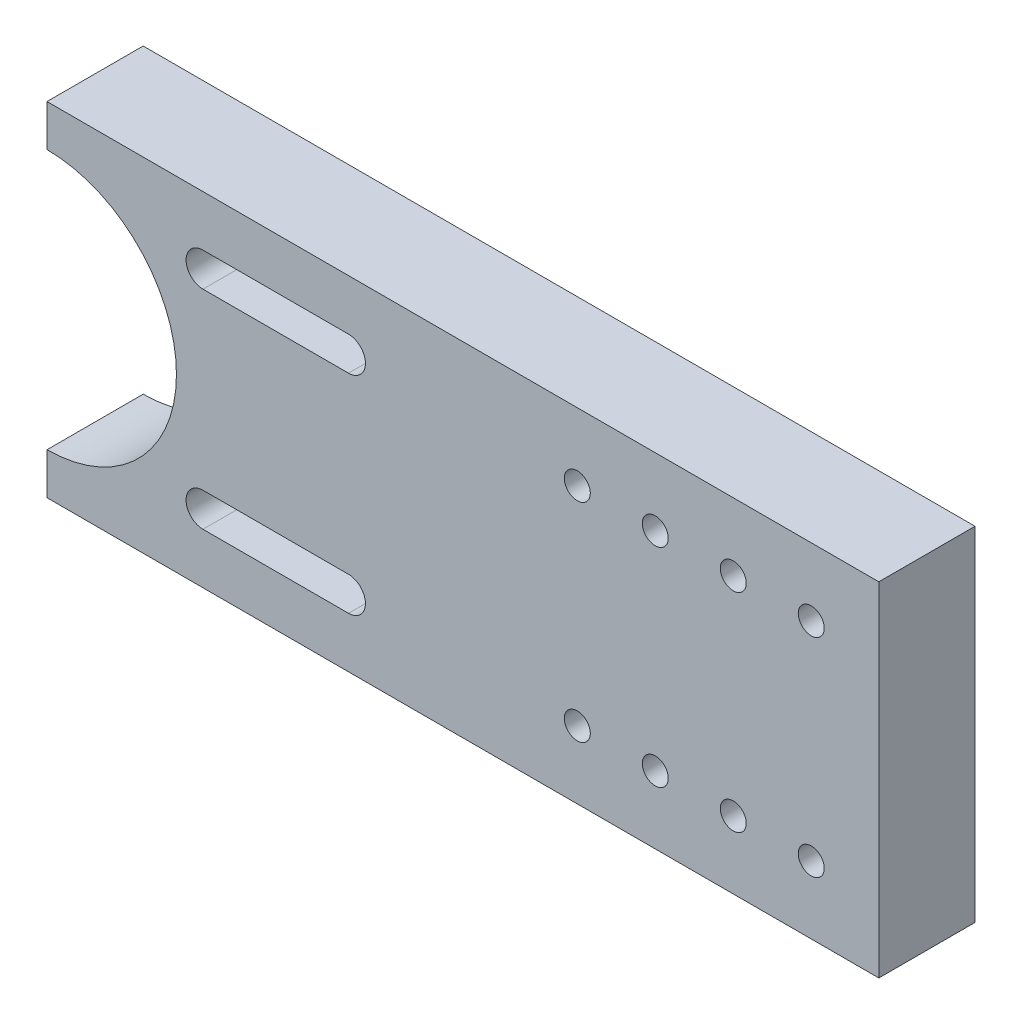
ISO-10303-21;
HEADER;
FILE_DESCRIPTION(('STEP AP214'),'2;1');
FILE_NAME('part.step','',(''),(''),'','','');
FILE_SCHEMA(('AUTOMOTIVE_DESIGN { 1 0 10303 214 1 1 1 1 }'));
ENDSEC;
DATA;
#1=APPLICATION_CONTEXT('core data for automotive mechanical design processes');
#2=APPLICATION_PROTOCOL_DEFINITION('international standard','automotive_design',2000,#1);
#3=PRODUCT_CONTEXT('',#1,'mechanical');
#4=PRODUCT('Part','Part','',(#3));
#5=PRODUCT_RELATED_PRODUCT_CATEGORY('part','',(#4));
#6=PRODUCT_DEFINITION_FORMATION('','',#4);
#7=PRODUCT_DEFINITION_CONTEXT('part definition',#1,'design');
#8=PRODUCT_DEFINITION('design','',#6,#7);
#9=PRODUCT_DEFINITION_SHAPE('','',#8);
#10=(LENGTH_UNIT() NAMED_UNIT(*) SI_UNIT(.MILLI.,.METRE.));
#11=(NAMED_UNIT(*) PLANE_ANGLE_UNIT() SI_UNIT($,.RADIAN.));
#12=(NAMED_UNIT(*) SI_UNIT($,.STERADIAN.) SOLID_ANGLE_UNIT());
#13=UNCERTAINTY_MEASURE_WITH_UNIT(LENGTH_MEASURE(1.E-05),#10,'distance_accuracy_value','');
#14=(GEOMETRIC_REPRESENTATION_CONTEXT(3) GLOBAL_UNCERTAINTY_ASSIGNED_CONTEXT((#13)) GLOBAL_UNIT_ASSIGNED_CONTEXT((#10,
#11,#12)) REPRESENTATION_CONTEXT('',''));
#15=CARTESIAN_POINT('',(0.,0.,0.));
#16=DIRECTION('',(0.,0.,1.));
#17=DIRECTION('',(1.,0.,0.));
#18=AXIS2_PLACEMENT_3D('',#15,#16,#17);
#19=CARTESIAN_POINT('',(0.,0.,18.5));
#20=DIRECTION('',(1.,0.,0.));
#21=DIRECTION('',(0.,0.,-1.));
#22=AXIS2_PLACEMENT_3D('',#19,#20,#21);
#23=PLANE('',#22);
#24=CARTESIAN_POINT('',(0.,61.,4.75000000000006));
#25=DIRECTION('',(-1.,0.,0.));
#26=DIRECTION('',(0.,0.,1.));
#27=AXIS2_PLACEMENT_3D('',#24,#25,#26);
#28=CIRCLE('',#27,1.65);
#29=CARTESIAN_POINT('',(0.,61.,6.40000000000005));
#30=VERTEX_POINT('',#29);
#31=EDGE_CURVE('E170',#30,#30,#28,.T.);
#32=ORIENTED_EDGE('',*,*,#31,.F.);
#33=EDGE_LOOP('',(#32));
#34=FACE_BOUND('',#33,.T.);
#35=CARTESIAN_POINT('',(0.,61.,13.75));
#36=DIRECTION('',(-1.,0.,0.));
#37=DIRECTION('',(0.,0.,1.));
#38=AXIS2_PLACEMENT_3D('',#35,#36,#37);
#39=CIRCLE('',#38,1.65);
#40=CARTESIAN_POINT('',(0.,61.,15.4));
#41=VERTEX_POINT('',#40);
#42=EDGE_CURVE('E176',#41,#41,#39,.T.);
#43=ORIENTED_EDGE('',*,*,#42,.F.);
#44=EDGE_LOOP('',(#43));
#45=FACE_BOUND('',#44,.T.);
#46=DIRECTION('',(0.,-1.,0.));
#47=VECTOR('',#46,1.);
#48=CARTESIAN_POINT('',(0.,0.,0.));
#49=LINE('',#48,#47);
#50=CARTESIAN_POINT('',(0.,66.,0.));
#51=VERTEX_POINT('',#50);
#52=CARTESIAN_POINT('',(0.,57.9997999992,0.));
#53=VERTEX_POINT('',#52);
#54=EDGE_CURVE('E286',#51,#53,#49,.T.);
#55=ORIENTED_EDGE('',*,*,#54,.T.);
#56=DIRECTION('',(0.,0.,1.));
#57=VECTOR('',#56,1.);
#58=CARTESIAN_POINT('',(0.,57.9997999992,-1.5));
#59=LINE('',#58,#57);
#60=CARTESIAN_POINT('',(0.,57.9997999992,18.5));
#61=VERTEX_POINT('',#60);
#62=EDGE_CURVE('E271',#53,#61,#59,.T.);
#63=ORIENTED_EDGE('',*,*,#62,.T.);
#64=DIRECTION('',(0.,-1.,0.));
#65=VECTOR('',#64,1.);
#66=CARTESIAN_POINT('',(0.,0.,18.5));
#67=LINE('',#66,#65);
#68=CARTESIAN_POINT('',(0.,66.,18.5));
#69=VERTEX_POINT('',#68);
#70=EDGE_CURVE('E275',#69,#61,#67,.T.);
#71=ORIENTED_EDGE('',*,*,#70,.F.);
#72=DIRECTION('',(0.,0.,-1.));
#73=VECTOR('',#72,1.);
#74=CARTESIAN_POINT('',(0.,66.,18.5));
#75=LINE('',#74,#73);
#76=EDGE_CURVE('E285',#69,#51,#75,.T.);
#77=ORIENTED_EDGE('',*,*,#76,.T.);
#78=EDGE_LOOP('',(#55,#63,#71,#77));
#79=FACE_BOUND('',#78,.T.);
#80=ADVANCED_FACE('F37',(#34,#45,#79),#23,.F.);
#81=CARTESIAN_POINT('',(0.,4.99999999999999,4.75000000000006));
#82=DIRECTION('',(-1.,0.,0.));
#83=DIRECTION('',(0.,0.,1.));
#84=AXIS2_PLACEMENT_3D('',#81,#82,#83);
#85=CIRCLE('',#84,1.65);
#86=CARTESIAN_POINT('',(0.,4.99999999999999,6.40000000000006));
#87=VERTEX_POINT('',#86);
#88=EDGE_CURVE('E160',#87,#87,#85,.T.);
#89=ORIENTED_EDGE('',*,*,#88,.F.);
#90=EDGE_LOOP('',(#89));
#91=FACE_BOUND('',#90,.T.);
#92=CARTESIAN_POINT('',(0.,5.,13.7500000000001));
#93=DIRECTION('',(-1.,0.,0.));
#94=DIRECTION('',(0.,0.,1.));
#95=AXIS2_PLACEMENT_3D('',#92,#93,#94);
#96=CIRCLE('',#95,1.65);
#97=CARTESIAN_POINT('',(0.,5.,15.4000000000001));
#98=VERTEX_POINT('',#97);
#99=EDGE_CURVE('E159',#98,#98,#96,.T.);
#100=ORIENTED_EDGE('',*,*,#99,.F.);
#101=EDGE_LOOP('',(#100));
#102=FACE_BOUND('',#101,.T.);
#103=CARTESIAN_POINT('',(0.,8.00020000080001,18.5));
#104=VERTEX_POINT('',#103);
#105=CARTESIAN_POINT('',(0.,0.,18.5));
#106=VERTEX_POINT('',#105);
#107=EDGE_CURVE('E279',#104,#106,#67,.T.);
#108=ORIENTED_EDGE('',*,*,#107,.F.);
#109=DIRECTION('',(0.,0.,1.));
#110=VECTOR('',#109,1.);
#111=CARTESIAN_POINT('',(0.,8.0002000008,-1.5));
#112=LINE('',#111,#110);
#113=CARTESIAN_POINT('',(0.,8.0002000008,0.));
#114=VERTEX_POINT('',#113);
#115=EDGE_CURVE('E268',#104,#114,#112,.F.);
#116=ORIENTED_EDGE('',*,*,#115,.T.);
#117=CARTESIAN_POINT('',(0.,0.,0.));
#118=VERTEX_POINT('',#117);
#119=EDGE_CURVE('E274',#114,#118,#49,.T.);
#120=ORIENTED_EDGE('',*,*,#119,.T.);
#121=DIRECTION('',(0.,0.,-1.));
#122=VECTOR('',#121,1.);
#123=CARTESIAN_POINT('',(0.,0.,18.5));
#124=LINE('',#123,#122);
#125=EDGE_CURVE('E303',#106,#118,#124,.T.);
#126=ORIENTED_EDGE('',*,*,#125,.F.);
#127=EDGE_LOOP('',(#108,#116,#120,#126));
#128=FACE_BOUND('',#127,.T.);
#129=ADVANCED_FACE('F354',(#91,#102,#128),#23,.F.);
#130=CARTESIAN_POINT('',(0.,0.,18.5));
#131=DIRECTION('',(0.,1.,0.));
#132=DIRECTION('',(0.,0.,1.));
#133=AXIS2_PLACEMENT_3D('',#130,#131,#132);
#134=PLANE('',#133);
#135=DIRECTION('',(1.,0.,0.));
#136=VECTOR('',#135,1.);
#137=CARTESIAN_POINT('',(0.,0.,0.));
#138=LINE('',#137,#136);
#139=CARTESIAN_POINT('',(160.,0.,0.));
#140=VERTEX_POINT('',#139);
#141=EDGE_CURVE('E289',#118,#140,#138,.T.);
#142=ORIENTED_EDGE('',*,*,#141,.T.);
#143=DIRECTION('',(0.,0.,-1.));
#144=VECTOR('',#143,1.);
#145=CARTESIAN_POINT('',(160.,0.,18.5));
#146=LINE('',#145,#144);
#147=CARTESIAN_POINT('',(160.,0.,18.5));
#148=VERTEX_POINT('',#147);
#149=EDGE_CURVE('E300',#148,#140,#146,.T.);
#150=ORIENTED_EDGE('',*,*,#149,.F.);
#151=DIRECTION('',(1.,0.,0.));
#152=VECTOR('',#151,1.);
#153=CARTESIAN_POINT('',(0.,0.,18.5));
#154=LINE('',#153,#152);
#155=EDGE_CURVE('E278',#106,#148,#154,.T.);
#156=ORIENTED_EDGE('',*,*,#155,.F.);
#157=ORIENTED_EDGE('',*,*,#125,.T.);
#158=EDGE_LOOP('',(#142,#150,#156,#157));
#159=FACE_BOUND('',#158,.T.);
#160=ADVANCED_FACE('F361',(#159),#134,.F.);
#161=CARTESIAN_POINT('',(160.,0.,18.5));
#162=DIRECTION('',(-1.,0.,0.));
#163=DIRECTION('',(0.,0.,1.));
#164=AXIS2_PLACEMENT_3D('',#161,#162,#163);
#165=PLANE('',#164);
#166=DIRECTION('',(0.,1.,0.));
#167=VECTOR('',#166,1.);
#168=CARTESIAN_POINT('',(160.,0.,0.));
#169=LINE('',#168,#167);
#170=CARTESIAN_POINT('',(160.,66.,0.));
#171=VERTEX_POINT('',#170);
#172=EDGE_CURVE('E291',#140,#171,#169,.T.);
#173=ORIENTED_EDGE('',*,*,#172,.T.);
#174=DIRECTION('',(0.,0.,-1.));
#175=VECTOR('',#174,1.);
#176=CARTESIAN_POINT('',(160.,66.,18.5));
#177=LINE('',#176,#175);
#178=CARTESIAN_POINT('',(160.,66.,18.5));
#179=VERTEX_POINT('',#178);
#180=EDGE_CURVE('E297',#179,#171,#177,.T.);
#181=ORIENTED_EDGE('',*,*,#180,.F.);
#182=DIRECTION('',(0.,1.,0.));
#183=VECTOR('',#182,1.);
#184=CARTESIAN_POINT('',(160.,0.,18.5));
#185=LINE('',#184,#183);
#186=EDGE_CURVE('E281',#148,#179,#185,.T.);
#187=ORIENTED_EDGE('',*,*,#186,.F.);
#188=ORIENTED_EDGE('',*,*,#149,.T.);
#189=EDGE_LOOP('',(#173,#181,#187,#188));
#190=FACE_BOUND('',#189,.T.);
#191=ADVANCED_FACE('F431',(#190),#165,.F.);
#192=CARTESIAN_POINT('',(0.,66.,18.5));
#193=DIRECTION('',(0.,-1.,0.));
#194=DIRECTION('',(0.,0.,-1.));
#195=AXIS2_PLACEMENT_3D('',#192,#193,#194);
#196=PLANE('',#195);
#197=DIRECTION('',(-1.,0.,0.));
#198=VECTOR('',#197,1.);
#199=CARTESIAN_POINT('',(0.,66.,0.));
#200=LINE('',#199,#198);
#201=EDGE_CURVE('E293',#171,#51,#200,.T.);
#202=ORIENTED_EDGE('',*,*,#201,.T.);
#203=ORIENTED_EDGE('',*,*,#76,.F.);
#204=DIRECTION('',(-1.,0.,0.));
#205=VECTOR('',#204,1.);
#206=CARTESIAN_POINT('',(0.,66.,18.5));
#207=LINE('',#206,#205);
#208=EDGE_CURVE('E283',#179,#69,#207,.T.);
#209=ORIENTED_EDGE('',*,*,#208,.F.);
#210=ORIENTED_EDGE('',*,*,#180,.T.);
#211=EDGE_LOOP('',(#202,#203,#209,#210));
#212=FACE_BOUND('',#211,.T.);
#213=ADVANCED_FACE('F348',(#212),#196,.F.);
#214=CARTESIAN_POINT('',(0.,66.,18.5));
#215=DIRECTION('',(0.,0.,-1.));
#216=DIRECTION('',(-1.,0.,0.));
#217=AXIS2_PLACEMENT_3D('',#214,#215,#216);
#218=PLANE('',#217);
#219=DIRECTION('',(-1.,0.,0.));
#220=VECTOR('',#219,1.);
#221=CARTESIAN_POINT('',(0.,9.74999999999999,18.5));
#222=LINE('',#221,#220);
#223=CARTESIAN_POINT('',(58.,9.74999999999998,18.5));
#224=VERTEX_POINT('',#223);
#225=CARTESIAN_POINT('',(30.,9.74999999999999,18.5));
#226=VERTEX_POINT('',#225);
#227=EDGE_CURVE('E204',#224,#226,#222,.T.);
#228=ORIENTED_EDGE('',*,*,#227,.T.);
#229=CARTESIAN_POINT('',(30.,13.,18.5));
#230=DIRECTION('',(0.,0.,-1.));
#231=DIRECTION('',(-1.,0.,0.));
#232=AXIS2_PLACEMENT_3D('',#229,#230,#231);
#233=CIRCLE('',#232,3.25000000000001);
#234=CARTESIAN_POINT('',(30.,16.25,18.5));
#235=VERTEX_POINT('',#234);
#236=EDGE_CURVE('E207',#226,#235,#233,.T.);
#237=ORIENTED_EDGE('',*,*,#236,.T.);
#238=DIRECTION('',(1.,0.,0.));
#239=VECTOR('',#238,1.);
#240=CARTESIAN_POINT('',(0.,16.25,18.5));
#241=LINE('',#240,#239);
#242=CARTESIAN_POINT('',(58.,16.25,18.5));
#243=VERTEX_POINT('',#242);
#244=EDGE_CURVE('E194',#235,#243,#241,.T.);
#245=ORIENTED_EDGE('',*,*,#244,.T.);
#246=CARTESIAN_POINT('',(58.,13.,18.5));
#247=DIRECTION('',(0.,0.,-1.));
#248=DIRECTION('',(-1.,0.,0.));
#249=AXIS2_PLACEMENT_3D('',#246,#247,#248);
#250=CIRCLE('',#249,3.25000000000001);
#251=EDGE_CURVE('E201',#243,#224,#250,.T.);
#252=ORIENTED_EDGE('',*,*,#251,.T.);
#253=EDGE_LOOP('',(#228,#237,#245,#252));
#254=FACE_BOUND('',#253,.T.);
#255=DIRECTION('',(-1.,0.,0.));
#256=VECTOR('',#255,1.);
#257=CARTESIAN_POINT('',(0.,49.75,18.5));
#258=LINE('',#257,#256);
#259=CARTESIAN_POINT('',(58.,49.75,18.5));
#260=VERTEX_POINT('',#259);
#261=CARTESIAN_POINT('',(30.,49.75,18.5));
#262=VERTEX_POINT('',#261);
#263=EDGE_CURVE('E236',#260,#262,#258,.T.);
#264=ORIENTED_EDGE('',*,*,#263,.T.);
#265=CARTESIAN_POINT('',(30.,53.,18.5));
#266=DIRECTION('',(0.,0.,-1.));
#267=DIRECTION('',(-1.,0.,0.));
#268=AXIS2_PLACEMENT_3D('',#265,#266,#267);
#269=CIRCLE('',#268,3.25000000000001);
#270=CARTESIAN_POINT('',(30.,56.25,18.5));
#271=VERTEX_POINT('',#270);
#272=EDGE_CURVE('E239',#262,#271,#269,.T.);
#273=ORIENTED_EDGE('',*,*,#272,.T.);
#274=DIRECTION('',(1.,0.,0.));
#275=VECTOR('',#274,1.);
#276=CARTESIAN_POINT('',(0.,56.25,18.5));
#277=LINE('',#276,#275);
#278=CARTESIAN_POINT('',(58.,56.25,18.5));
#279=VERTEX_POINT('',#278);
#280=EDGE_CURVE('E224',#271,#279,#277,.T.);
#281=ORIENTED_EDGE('',*,*,#280,.T.);
#282=CARTESIAN_POINT('',(58.,53.,18.5));
#283=DIRECTION('',(0.,0.,-1.));
#284=DIRECTION('',(-1.,0.,0.));
#285=AXIS2_PLACEMENT_3D('',#282,#283,#284);
#286=CIRCLE('',#285,3.25000000000001);
#287=EDGE_CURVE('E233',#279,#260,#286,.T.);
#288=ORIENTED_EDGE('',*,*,#287,.T.);
#289=EDGE_LOOP('',(#264,#273,#281,#288));
#290=FACE_BOUND('',#289,.T.);
#291=CARTESIAN_POINT('',(132.,13.,18.5));
#292=DIRECTION('',(0.,0.,-1.));
#293=DIRECTION('',(-1.,0.,0.));
#294=AXIS2_PLACEMENT_3D('',#291,#292,#293);
#295=CIRCLE('',#294,2.5);
#296=CARTESIAN_POINT('',(129.5,13.,18.5));
#297=VERTEX_POINT('',#296);
#298=EDGE_CURVE('E242',#297,#297,#295,.T.);
#299=ORIENTED_EDGE('',*,*,#298,.T.);
#300=EDGE_LOOP('',(#299));
#301=FACE_BOUND('',#300,.T.);
#302=CARTESIAN_POINT('',(132.,53.,18.5));
#303=DIRECTION('',(0.,0.,-1.));
#304=DIRECTION('',(-1.,0.,0.));
#305=AXIS2_PLACEMENT_3D('',#302,#303,#304);
#306=CIRCLE('',#305,2.5);
#307=CARTESIAN_POINT('',(129.5,53.,18.5));
#308=VERTEX_POINT('',#307);
#309=EDGE_CURVE('E248',#308,#308,#306,.T.);
#310=ORIENTED_EDGE('',*,*,#309,.T.);
#311=EDGE_LOOP('',(#310));
#312=FACE_BOUND('',#311,.T.);
#313=CARTESIAN_POINT('',(147.,53.,18.5));
#314=DIRECTION('',(0.,0.,-1.));
#315=DIRECTION('',(-1.,0.,0.));
#316=AXIS2_PLACEMENT_3D('',#313,#314,#315);
#317=CIRCLE('',#316,2.5);
#318=CARTESIAN_POINT('',(144.5,53.,18.5));
#319=VERTEX_POINT('',#318);
#320=EDGE_CURVE('E257',#319,#319,#317,.T.);
#321=ORIENTED_EDGE('',*,*,#320,.T.);
#322=EDGE_LOOP('',(#321));
#323=FACE_BOUND('',#322,.T.);
#324=CARTESIAN_POINT('',(147.,13.,18.5));
#325=DIRECTION('',(0.,0.,-1.));
#326=DIRECTION('',(-1.,0.,0.));
#327=AXIS2_PLACEMENT_3D('',#324,#325,#326);
#328=CIRCLE('',#327,2.5);
#329=CARTESIAN_POINT('',(144.5,13.,18.5));
#330=VERTEX_POINT('',#329);
#331=EDGE_CURVE('E263',#330,#330,#328,.T.);
#332=ORIENTED_EDGE('',*,*,#331,.T.);
#333=EDGE_LOOP('',(#332));
#334=FACE_BOUND('',#333,.T.);
#335=ORIENTED_EDGE('',*,*,#70,.T.);
#336=CARTESIAN_POINT('',(-0.099999999999996,33.,18.5));
#337=DIRECTION('',(0.,0.,1.));
#338=DIRECTION('',(1.,0.,0.));
#339=AXIS2_PLACEMENT_3D('',#336,#337,#338);
#340=CIRCLE('',#339,25.);
#341=EDGE_CURVE('E266',#104,#61,#340,.T.);
#342=ORIENTED_EDGE('',*,*,#341,.F.);
#343=ORIENTED_EDGE('',*,*,#107,.T.);
#344=ORIENTED_EDGE('',*,*,#155,.T.);
#345=ORIENTED_EDGE('',*,*,#186,.T.);
#346=ORIENTED_EDGE('',*,*,#208,.T.);
#347=EDGE_LOOP('',(#335,#342,#343,#344,#345,#346));
#348=FACE_BOUND('',#347,.T.);
#349=CARTESIAN_POINT('',(117.,53.,18.5));
#350=DIRECTION('',(0.,0.,-1.));
#351=DIRECTION('',(-1.,0.,0.));
#352=AXIS2_PLACEMENT_3D('',#349,#350,#351);
#353=CIRCLE('',#352,2.5);
#354=CARTESIAN_POINT('',(114.5,53.,18.5));
#355=VERTEX_POINT('',#354);
#356=EDGE_CURVE('E308',#355,#355,#353,.T.);
#357=ORIENTED_EDGE('',*,*,#356,.T.);
#358=EDGE_LOOP('',(#357));
#359=FACE_BOUND('',#358,.T.);
#360=CARTESIAN_POINT('',(102.,53.,18.5));
#361=DIRECTION('',(0.,0.,-1.));
#362=DIRECTION('',(-1.,0.,0.));
#363=AXIS2_PLACEMENT_3D('',#360,#361,#362);
#364=CIRCLE('',#363,2.5);
#365=CARTESIAN_POINT('',(99.5,53.,18.5));
#366=VERTEX_POINT('',#365);
#367=EDGE_CURVE('E314',#366,#366,#364,.T.);
#368=ORIENTED_EDGE('',*,*,#367,.T.);
#369=EDGE_LOOP('',(#368));
#370=FACE_BOUND('',#369,.T.);
#371=CARTESIAN_POINT('',(117.,13.,18.5));
#372=DIRECTION('',(0.,0.,-1.));
#373=DIRECTION('',(-1.,0.,0.));
#374=AXIS2_PLACEMENT_3D('',#371,#372,#373);
#375=CIRCLE('',#374,2.5);
#376=CARTESIAN_POINT('',(114.5,13.,18.5));
#377=VERTEX_POINT('',#376);
#378=EDGE_CURVE('E320',#377,#377,#375,.T.);
#379=ORIENTED_EDGE('',*,*,#378,.T.);
#380=EDGE_LOOP('',(#379));
#381=FACE_BOUND('',#380,.T.);
#382=CARTESIAN_POINT('',(102.,13.,18.5));
#383=DIRECTION('',(0.,0.,-1.));
#384=DIRECTION('',(-1.,0.,0.));
#385=AXIS2_PLACEMENT_3D('',#382,#383,#384);
#386=CIRCLE('',#385,2.5);
#387=CARTESIAN_POINT('',(99.5,13.,18.5));
#388=VERTEX_POINT('',#387);
#389=EDGE_CURVE('E45',#388,#388,#386,.T.);
#390=ORIENTED_EDGE('',*,*,#389,.T.);
#391=EDGE_LOOP('',(#390));
#392=FACE_BOUND('',#391,.T.);
#393=ADVANCED_FACE('F328',(#254,#290,#301,#312,#323,#334,#348,#359,#370,#381,#392),#218,.F.);
#394=CARTESIAN_POINT('',(0.,66.,0.));
#395=DIRECTION('',(0.,0.,-1.));
#396=DIRECTION('',(-1.,0.,0.));
#397=AXIS2_PLACEMENT_3D('',#394,#395,#396);
#398=PLANE('',#397);
#399=CARTESIAN_POINT('',(30.,13.,0.));
#400=DIRECTION('',(0.,0.,-1.));
#401=DIRECTION('',(1.,0.,0.));
#402=AXIS2_PLACEMENT_3D('',#399,#400,#401);
#403=CIRCLE('',#402,3.25000000000001);
#404=CARTESIAN_POINT('',(30.,9.74999999999999,0.));
#405=VERTEX_POINT('',#404);
#406=CARTESIAN_POINT('',(30.,16.25,0.));
#407=VERTEX_POINT('',#406);
#408=EDGE_CURVE('E60',#405,#407,#403,.T.);
#409=ORIENTED_EDGE('',*,*,#408,.F.);
#410=DIRECTION('',(-1.,0.,0.));
#411=VECTOR('',#410,1.);
#412=CARTESIAN_POINT('',(30.,9.74999999999999,0.));
#413=LINE('',#412,#411);
#414=CARTESIAN_POINT('',(58.,9.74999999999998,0.));
#415=VERTEX_POINT('',#414);
#416=EDGE_CURVE('E188',#415,#405,#413,.T.);
#417=ORIENTED_EDGE('',*,*,#416,.F.);
#418=CARTESIAN_POINT('',(58.,13.,0.));
#419=DIRECTION('',(0.,0.,-1.));
#420=DIRECTION('',(1.,0.,0.));
#421=AXIS2_PLACEMENT_3D('',#418,#419,#420);
#422=CIRCLE('',#421,3.25000000000001);
#423=CARTESIAN_POINT('',(58.,16.25,0.));
#424=VERTEX_POINT('',#423);
#425=EDGE_CURVE('E185',#424,#415,#422,.T.);
#426=ORIENTED_EDGE('',*,*,#425,.F.);
#427=DIRECTION('',(1.,0.,0.));
#428=VECTOR('',#427,1.);
#429=CARTESIAN_POINT('',(30.,16.25,0.));
#430=LINE('',#429,#428);
#431=EDGE_CURVE('E183',#407,#424,#430,.T.);
#432=ORIENTED_EDGE('',*,*,#431,.F.);
#433=EDGE_LOOP('',(#409,#417,#426,#432));
#434=FACE_BOUND('',#433,.T.);
#435=CARTESIAN_POINT('',(30.,53.,0.));
#436=DIRECTION('',(0.,0.,-1.));
#437=DIRECTION('',(-1.,0.,0.));
#438=AXIS2_PLACEMENT_3D('',#435,#436,#437);
#439=CIRCLE('',#438,3.25000000000001);
#440=CARTESIAN_POINT('',(30.,49.75,0.));
#441=VERTEX_POINT('',#440);
#442=CARTESIAN_POINT('',(30.,56.25,0.));
#443=VERTEX_POINT('',#442);
#444=EDGE_CURVE('E210',#441,#443,#439,.T.);
#445=ORIENTED_EDGE('',*,*,#444,.F.);
#446=DIRECTION('',(-1.,0.,0.));
#447=VECTOR('',#446,1.);
#448=CARTESIAN_POINT('',(30.,49.75,0.));
#449=LINE('',#448,#447);
#450=CARTESIAN_POINT('',(58.,49.75,0.));
#451=VERTEX_POINT('',#450);
#452=EDGE_CURVE('E218',#451,#441,#449,.T.);
#453=ORIENTED_EDGE('',*,*,#452,.F.);
#454=CARTESIAN_POINT('',(58.,53.,0.));
#455=DIRECTION('',(0.,0.,-1.));
#456=DIRECTION('',(-1.,0.,0.));
#457=AXIS2_PLACEMENT_3D('',#454,#455,#456);
#458=CIRCLE('',#457,3.25000000000001);
#459=CARTESIAN_POINT('',(58.,56.25,0.));
#460=VERTEX_POINT('',#459);
#461=EDGE_CURVE('E215',#460,#451,#458,.T.);
#462=ORIENTED_EDGE('',*,*,#461,.F.);
#463=DIRECTION('',(1.,0.,0.));
#464=VECTOR('',#463,1.);
#465=CARTESIAN_POINT('',(30.,56.25,0.));
#466=LINE('',#465,#464);
#467=EDGE_CURVE('E212',#443,#460,#466,.T.);
#468=ORIENTED_EDGE('',*,*,#467,.F.);
#469=EDGE_LOOP('',(#445,#453,#462,#468));
#470=FACE_BOUND('',#469,.T.);
#471=CARTESIAN_POINT('',(132.,13.,0.));
#472=DIRECTION('',(0.,0.,-1.));
#473=DIRECTION('',(-1.,0.,0.));
#474=AXIS2_PLACEMENT_3D('',#471,#472,#473);
#475=CIRCLE('',#474,2.49999999999997);
#476=CARTESIAN_POINT('',(129.5,13.,0.));
#477=VERTEX_POINT('',#476);
#478=EDGE_CURVE('E245',#477,#477,#475,.T.);
#479=ORIENTED_EDGE('',*,*,#478,.F.);
#480=EDGE_LOOP('',(#479));
#481=FACE_BOUND('',#480,.T.);
#482=CARTESIAN_POINT('',(132.,53.,0.));
#483=DIRECTION('',(0.,0.,-1.));
#484=DIRECTION('',(-1.,0.,0.));
#485=AXIS2_PLACEMENT_3D('',#482,#483,#484);
#486=CIRCLE('',#485,2.49999999999997);
#487=CARTESIAN_POINT('',(129.5,53.,0.));
#488=VERTEX_POINT('',#487);
#489=EDGE_CURVE('E251',#488,#488,#486,.T.);
#490=ORIENTED_EDGE('',*,*,#489,.F.);
#491=EDGE_LOOP('',(#490));
#492=FACE_BOUND('',#491,.T.);
#493=CARTESIAN_POINT('',(147.,53.,0.));
#494=DIRECTION('',(0.,0.,-1.));
#495=DIRECTION('',(-1.,0.,0.));
#496=AXIS2_PLACEMENT_3D('',#493,#494,#495);
#497=CIRCLE('',#496,2.49999999999997);
#498=CARTESIAN_POINT('',(144.5,53.,0.));
#499=VERTEX_POINT('',#498);
#500=EDGE_CURVE('E254',#499,#499,#497,.T.);
#501=ORIENTED_EDGE('',*,*,#500,.F.);
#502=EDGE_LOOP('',(#501));
#503=FACE_BOUND('',#502,.T.);
#504=CARTESIAN_POINT('',(147.,13.,0.));
#505=DIRECTION('',(0.,0.,-1.));
#506=DIRECTION('',(-1.,0.,0.));
#507=AXIS2_PLACEMENT_3D('',#504,#505,#506);
#508=CIRCLE('',#507,2.49999999999997);
#509=CARTESIAN_POINT('',(144.5,13.,0.));
#510=VERTEX_POINT('',#509);
#511=EDGE_CURVE('E260',#510,#510,#508,.T.);
#512=ORIENTED_EDGE('',*,*,#511,.F.);
#513=EDGE_LOOP('',(#512));
#514=FACE_BOUND('',#513,.T.);
#515=CARTESIAN_POINT('',(-0.099999999999996,33.,0.));
#516=DIRECTION('',(0.,0.,-1.));
#517=DIRECTION('',(-1.,0.,0.));
#518=AXIS2_PLACEMENT_3D('',#515,#516,#517);
#519=CIRCLE('',#518,25.);
#520=EDGE_CURVE('E306',#53,#114,#519,.T.);
#521=ORIENTED_EDGE('',*,*,#520,.F.);
#522=ORIENTED_EDGE('',*,*,#54,.F.);
#523=ORIENTED_EDGE('',*,*,#201,.F.);
#524=ORIENTED_EDGE('',*,*,#172,.F.);
#525=ORIENTED_EDGE('',*,*,#141,.F.);
#526=ORIENTED_EDGE('',*,*,#119,.F.);
#527=EDGE_LOOP('',(#521,#522,#523,#524,#525,#526));
#528=FACE_BOUND('',#527,.T.);
#529=CARTESIAN_POINT('',(117.,53.,0.));
#530=DIRECTION('',(0.,0.,-1.));
#531=DIRECTION('',(-1.,0.,0.));
#532=AXIS2_PLACEMENT_3D('',#529,#530,#531);
#533=CIRCLE('',#532,2.49999999999997);
#534=CARTESIAN_POINT('',(114.5,53.,0.));
#535=VERTEX_POINT('',#534);
#536=EDGE_CURVE('E311',#535,#535,#533,.T.);
#537=ORIENTED_EDGE('',*,*,#536,.F.);
#538=EDGE_LOOP('',(#537));
#539=FACE_BOUND('',#538,.T.);
#540=CARTESIAN_POINT('',(102.,53.,0.));
#541=DIRECTION('',(0.,0.,-1.));
#542=DIRECTION('',(-1.,0.,0.));
#543=AXIS2_PLACEMENT_3D('',#540,#541,#542);
#544=CIRCLE('',#543,2.49999999999997);
#545=CARTESIAN_POINT('',(99.5,53.,0.));
#546=VERTEX_POINT('',#545);
#547=EDGE_CURVE('E317',#546,#546,#544,.T.);
#548=ORIENTED_EDGE('',*,*,#547,.F.);
#549=EDGE_LOOP('',(#548));
#550=FACE_BOUND('',#549,.T.);
#551=CARTESIAN_POINT('',(117.,13.,0.));
#552=DIRECTION('',(0.,0.,-1.));
#553=DIRECTION('',(-1.,0.,0.));
#554=AXIS2_PLACEMENT_3D('',#551,#552,#553);
#555=CIRCLE('',#554,2.49999999999997);
#556=CARTESIAN_POINT('',(114.5,13.,0.));
#557=VERTEX_POINT('',#556);
#558=EDGE_CURVE('E323',#557,#557,#555,.T.);
#559=ORIENTED_EDGE('',*,*,#558,.F.);
#560=EDGE_LOOP('',(#559));
#561=FACE_BOUND('',#560,.T.);
#562=CARTESIAN_POINT('',(102.,13.,0.));
#563=DIRECTION('',(0.,0.,-1.));
#564=DIRECTION('',(-1.,0.,0.));
#565=AXIS2_PLACEMENT_3D('',#562,#563,#564);
#566=CIRCLE('',#565,2.49999999999997);
#567=CARTESIAN_POINT('',(99.5,13.,0.));
#568=VERTEX_POINT('',#567);
#569=EDGE_CURVE('E11',#568,#568,#566,.T.);
#570=ORIENTED_EDGE('',*,*,#569,.F.);
#571=EDGE_LOOP('',(#570));
#572=FACE_BOUND('',#571,.T.);
#573=ADVANCED_FACE('F336',(#434,#470,#481,#492,#503,#514,#528,#539,#550,#561,#572),#398,.T.);
#574=CARTESIAN_POINT('',(-0.099999999999996,33.,-1.5));
#575=DIRECTION('',(0.,0.,1.));
#576=DIRECTION('',(1.,0.,0.));
#577=AXIS2_PLACEMENT_3D('',#574,#575,#576);
#578=CYLINDRICAL_SURFACE('',#577,25.);
#579=ORIENTED_EDGE('',*,*,#520,.T.);
#580=ORIENTED_EDGE('',*,*,#115,.F.);
#581=ORIENTED_EDGE('',*,*,#341,.T.);
#582=ORIENTED_EDGE('',*,*,#62,.F.);
#583=EDGE_LOOP('',(#579,#580,#581,#582));
#584=FACE_BOUND('',#583,.T.);
#585=ADVANCED_FACE('F338',(#584),#578,.F.);
#586=CARTESIAN_POINT('',(147.,13.,0.));
#587=DIRECTION('',(0.,0.,-1.));
#588=DIRECTION('',(-1.,0.,0.));
#589=AXIS2_PLACEMENT_3D('',#586,#587,#588);
#590=CYLINDRICAL_SURFACE('',#589,2.49999999999999);
#591=ORIENTED_EDGE('',*,*,#331,.F.);
#592=EDGE_LOOP('',(#591));
#593=FACE_BOUND('',#592,.T.);
#594=ORIENTED_EDGE('',*,*,#511,.T.);
#595=EDGE_LOOP('',(#594));
#596=FACE_BOUND('',#595,.T.);
#597=ADVANCED_FACE('F345',(#593,#596),#590,.F.);
#598=CARTESIAN_POINT('',(147.,53.,0.));
#599=DIRECTION('',(0.,0.,-1.));
#600=DIRECTION('',(-1.,0.,0.));
#601=AXIS2_PLACEMENT_3D('',#598,#599,#600);
#602=CYLINDRICAL_SURFACE('',#601,2.49999999999999);
#603=ORIENTED_EDGE('',*,*,#320,.F.);
#604=EDGE_LOOP('',(#603));
#605=FACE_BOUND('',#604,.T.);
#606=ORIENTED_EDGE('',*,*,#500,.T.);
#607=EDGE_LOOP('',(#606));
#608=FACE_BOUND('',#607,.T.);
#609=ADVANCED_FACE('F398',(#605,#608),#602,.F.);
#610=CARTESIAN_POINT('',(132.,53.,0.));
#611=DIRECTION('',(0.,0.,-1.));
#612=DIRECTION('',(-1.,0.,0.));
#613=AXIS2_PLACEMENT_3D('',#610,#611,#612);
#614=CYLINDRICAL_SURFACE('',#613,2.49999999999999);
#615=ORIENTED_EDGE('',*,*,#309,.F.);
#616=EDGE_LOOP('',(#615));
#617=FACE_BOUND('',#616,.T.);
#618=ORIENTED_EDGE('',*,*,#489,.T.);
#619=EDGE_LOOP('',(#618));
#620=FACE_BOUND('',#619,.T.);
#621=ADVANCED_FACE('F372',(#617,#620),#614,.F.);
#622=CARTESIAN_POINT('',(117.,53.,0.));
#623=DIRECTION('',(0.,0.,-1.));
#624=DIRECTION('',(-1.,0.,0.));
#625=AXIS2_PLACEMENT_3D('',#622,#623,#624);
#626=CYLINDRICAL_SURFACE('',#625,2.49999999999999);
#627=ORIENTED_EDGE('',*,*,#356,.F.);
#628=EDGE_LOOP('',(#627));
#629=FACE_BOUND('',#628,.T.);
#630=ORIENTED_EDGE('',*,*,#536,.T.);
#631=EDGE_LOOP('',(#630));
#632=FACE_BOUND('',#631,.T.);
#633=ADVANCED_FACE('F368',(#629,#632),#626,.F.);
#634=CARTESIAN_POINT('',(102.,53.,0.));
#635=DIRECTION('',(0.,0.,-1.));
#636=DIRECTION('',(-1.,0.,0.));
#637=AXIS2_PLACEMENT_3D('',#634,#635,#636);
#638=CYLINDRICAL_SURFACE('',#637,2.49999999999999);
#639=ORIENTED_EDGE('',*,*,#367,.F.);
#640=EDGE_LOOP('',(#639));
#641=FACE_BOUND('',#640,.T.);
#642=ORIENTED_EDGE('',*,*,#547,.T.);
#643=EDGE_LOOP('',(#642));
#644=FACE_BOUND('',#643,.T.);
#645=ADVANCED_FACE('F371',(#641,#644),#638,.F.);
#646=CARTESIAN_POINT('',(132.,13.,0.));
#647=DIRECTION('',(0.,0.,-1.));
#648=DIRECTION('',(-1.,0.,0.));
#649=AXIS2_PLACEMENT_3D('',#646,#647,#648);
#650=CYLINDRICAL_SURFACE('',#649,2.49999999999999);
#651=ORIENTED_EDGE('',*,*,#298,.F.);
#652=EDGE_LOOP('',(#651));
#653=FACE_BOUND('',#652,.T.);
#654=ORIENTED_EDGE('',*,*,#478,.T.);
#655=EDGE_LOOP('',(#654));
#656=FACE_BOUND('',#655,.T.);
#657=ADVANCED_FACE('F375',(#653,#656),#650,.F.);
#658=CARTESIAN_POINT('',(117.,13.,0.));
#659=DIRECTION('',(0.,0.,-1.));
#660=DIRECTION('',(-1.,0.,0.));
#661=AXIS2_PLACEMENT_3D('',#658,#659,#660);
#662=CYLINDRICAL_SURFACE('',#661,2.49999999999999);
#663=ORIENTED_EDGE('',*,*,#378,.F.);
#664=EDGE_LOOP('',(#663));
#665=FACE_BOUND('',#664,.T.);
#666=ORIENTED_EDGE('',*,*,#558,.T.);
#667=EDGE_LOOP('',(#666));
#668=FACE_BOUND('',#667,.T.);
#669=ADVANCED_FACE('F333',(#665,#668),#662,.F.);
#670=CARTESIAN_POINT('',(102.,13.,0.));
#671=DIRECTION('',(0.,0.,-1.));
#672=DIRECTION('',(-1.,0.,0.));
#673=AXIS2_PLACEMENT_3D('',#670,#671,#672);
#674=CYLINDRICAL_SURFACE('',#673,2.49999999999999);
#675=ORIENTED_EDGE('',*,*,#389,.F.);
#676=EDGE_LOOP('',(#675));
#677=FACE_BOUND('',#676,.T.);
#678=ORIENTED_EDGE('',*,*,#569,.T.);
#679=EDGE_LOOP('',(#678));
#680=FACE_BOUND('',#679,.T.);
#681=ADVANCED_FACE('F39',(#677,#680),#674,.F.);
#682=CARTESIAN_POINT('',(30.,53.,40.));
#683=DIRECTION('',(0.,0.,-1.));
#684=DIRECTION('',(-1.,0.,0.));
#685=AXIS2_PLACEMENT_3D('',#682,#683,#684);
#686=CYLINDRICAL_SURFACE('',#685,3.25000000000001);
#687=DIRECTION('',(0.,0.,-1.));
#688=VECTOR('',#687,1.);
#689=CARTESIAN_POINT('',(30.,49.75,40.));
#690=LINE('',#689,#688);
#691=EDGE_CURVE('E222',#262,#441,#690,.T.);
#692=ORIENTED_EDGE('',*,*,#691,.T.);
#693=ORIENTED_EDGE('',*,*,#444,.T.);
#694=DIRECTION('',(0.,0.,-1.));
#695=VECTOR('',#694,1.);
#696=CARTESIAN_POINT('',(30.,56.25,40.));
#697=LINE('',#696,#695);
#698=EDGE_CURVE('E221',#271,#443,#697,.T.);
#699=ORIENTED_EDGE('',*,*,#698,.F.);
#700=ORIENTED_EDGE('',*,*,#272,.F.);
#701=EDGE_LOOP('',(#692,#693,#699,#700));
#702=FACE_BOUND('',#701,.T.);
#703=ADVANCED_FACE('F332',(#702),#686,.F.);
#704=CARTESIAN_POINT('',(30.,49.75,40.));
#705=DIRECTION('',(0.,-1.,0.));
#706=DIRECTION('',(0.,0.,-1.));
#707=AXIS2_PLACEMENT_3D('',#704,#705,#706);
#708=PLANE('',#707);
#709=DIRECTION('',(0.,0.,-1.));
#710=VECTOR('',#709,1.);
#711=CARTESIAN_POINT('',(58.,49.75,40.));
#712=LINE('',#711,#710);
#713=EDGE_CURVE('E225',#260,#451,#712,.T.);
#714=ORIENTED_EDGE('',*,*,#713,.T.);
#715=ORIENTED_EDGE('',*,*,#452,.T.);
#716=ORIENTED_EDGE('',*,*,#691,.F.);
#717=ORIENTED_EDGE('',*,*,#263,.F.);
#718=EDGE_LOOP('',(#714,#715,#716,#717));
#719=FACE_BOUND('',#718,.T.);
#720=ADVANCED_FACE('F477',(#719),#708,.F.);
#721=CARTESIAN_POINT('',(58.,53.,40.));
#722=DIRECTION('',(0.,0.,-1.));
#723=DIRECTION('',(-1.,0.,0.));
#724=AXIS2_PLACEMENT_3D('',#721,#722,#723);
#725=CYLINDRICAL_SURFACE('',#724,3.25000000000001);
#726=DIRECTION('',(0.,0.,-1.));
#727=VECTOR('',#726,1.);
#728=CARTESIAN_POINT('',(58.,56.25,40.));
#729=LINE('',#728,#727);
#730=EDGE_CURVE('E227',#279,#460,#729,.T.);
#731=ORIENTED_EDGE('',*,*,#730,.T.);
#732=ORIENTED_EDGE('',*,*,#461,.T.);
#733=ORIENTED_EDGE('',*,*,#713,.F.);
#734=ORIENTED_EDGE('',*,*,#287,.F.);
#735=EDGE_LOOP('',(#731,#732,#733,#734));
#736=FACE_BOUND('',#735,.T.);
#737=ADVANCED_FACE('F486',(#736),#725,.F.);
#738=CARTESIAN_POINT('',(30.,56.25,40.));
#739=DIRECTION('',(0.,1.,0.));
#740=DIRECTION('',(0.,0.,1.));
#741=AXIS2_PLACEMENT_3D('',#738,#739,#740);
#742=PLANE('',#741);
#743=ORIENTED_EDGE('',*,*,#698,.T.);
#744=ORIENTED_EDGE('',*,*,#467,.T.);
#745=ORIENTED_EDGE('',*,*,#730,.F.);
#746=ORIENTED_EDGE('',*,*,#280,.F.);
#747=EDGE_LOOP('',(#743,#744,#745,#746));
#748=FACE_BOUND('',#747,.T.);
#749=ADVANCED_FACE('F496',(#748),#742,.F.);
#750=CARTESIAN_POINT('',(30.,13.,40.));
#751=DIRECTION('',(0.,0.,-1.));
#752=DIRECTION('',(-1.,0.,0.));
#753=AXIS2_PLACEMENT_3D('',#750,#751,#752);
#754=CYLINDRICAL_SURFACE('',#753,3.25000000000001);
#755=DIRECTION('',(0.,0.,-1.));
#756=VECTOR('',#755,1.);
#757=CARTESIAN_POINT('',(30.,9.74999999999999,40.));
#758=LINE('',#757,#756);
#759=EDGE_CURVE('E192',#226,#405,#758,.T.);
#760=ORIENTED_EDGE('',*,*,#759,.T.);
#761=ORIENTED_EDGE('',*,*,#408,.T.);
#762=DIRECTION('',(0.,0.,-1.));
#763=VECTOR('',#762,1.);
#764=CARTESIAN_POINT('',(30.,16.25,40.));
#765=LINE('',#764,#763);
#766=EDGE_CURVE('E191',#235,#407,#765,.T.);
#767=ORIENTED_EDGE('',*,*,#766,.F.);
#768=ORIENTED_EDGE('',*,*,#236,.F.);
#769=EDGE_LOOP('',(#760,#761,#767,#768));
#770=FACE_BOUND('',#769,.T.);
#771=ADVANCED_FACE('F506',(#770),#754,.F.);
#772=CARTESIAN_POINT('',(30.,9.74999999999999,40.));
#773=DIRECTION('',(0.,-1.,0.));
#774=DIRECTION('',(0.,0.,-1.));
#775=AXIS2_PLACEMENT_3D('',#772,#773,#774);
#776=PLANE('',#775);
#777=DIRECTION('',(0.,0.,-1.));
#778=VECTOR('',#777,1.);
#779=CARTESIAN_POINT('',(58.,9.74999999999998,40.));
#780=LINE('',#779,#778);
#781=EDGE_CURVE('E195',#224,#415,#780,.T.);
#782=ORIENTED_EDGE('',*,*,#781,.T.);
#783=ORIENTED_EDGE('',*,*,#416,.T.);
#784=ORIENTED_EDGE('',*,*,#759,.F.);
#785=ORIENTED_EDGE('',*,*,#227,.F.);
#786=EDGE_LOOP('',(#782,#783,#784,#785));
#787=FACE_BOUND('',#786,.T.);
#788=ADVANCED_FACE('F515',(#787),#776,.F.);
#789=CARTESIAN_POINT('',(58.,13.,40.));
#790=DIRECTION('',(0.,0.,-1.));
#791=DIRECTION('',(-1.,0.,0.));
#792=AXIS2_PLACEMENT_3D('',#789,#790,#791);
#793=CYLINDRICAL_SURFACE('',#792,3.25000000000001);
#794=DIRECTION('',(0.,0.,-1.));
#795=VECTOR('',#794,1.);
#796=CARTESIAN_POINT('',(58.,16.25,40.));
#797=LINE('',#796,#795);
#798=EDGE_CURVE('E52',#243,#424,#797,.T.);
#799=ORIENTED_EDGE('',*,*,#798,.T.);
#800=ORIENTED_EDGE('',*,*,#425,.T.);
#801=ORIENTED_EDGE('',*,*,#781,.F.);
#802=ORIENTED_EDGE('',*,*,#251,.F.);
#803=EDGE_LOOP('',(#799,#800,#801,#802));
#804=FACE_BOUND('',#803,.T.);
#805=ADVANCED_FACE('F524',(#804),#793,.F.);
#806=CARTESIAN_POINT('',(30.,16.25,40.));
#807=DIRECTION('',(0.,1.,0.));
#808=DIRECTION('',(0.,0.,1.));
#809=AXIS2_PLACEMENT_3D('',#806,#807,#808);
#810=PLANE('',#809);
#811=ORIENTED_EDGE('',*,*,#766,.T.);
#812=ORIENTED_EDGE('',*,*,#431,.T.);
#813=ORIENTED_EDGE('',*,*,#798,.F.);
#814=ORIENTED_EDGE('',*,*,#244,.F.);
#815=EDGE_LOOP('',(#811,#812,#813,#814));
#816=FACE_BOUND('',#815,.T.);
#817=ADVANCED_FACE('F533',(#816),#810,.F.);
#818=CARTESIAN_POINT('',(10.1,61.,13.75));
#819=DIRECTION('',(-1.,0.,0.));
#820=DIRECTION('',(0.,0.,1.));
#821=AXIS2_PLACEMENT_3D('',#818,#819,#820);
#822=CONICAL_SURFACE('',#821,1.65,1.02974425867665);
#823=CARTESIAN_POINT('',(11.0914200213955,61.,13.75));
#824=VERTEX_POINT('',#823);
#825=VERTEX_LOOP('',#824);
#826=FACE_BOUND('',#825,.T.);
#827=CARTESIAN_POINT('',(10.1,61.,13.75));
#828=DIRECTION('',(-1.,0.,0.));
#829=DIRECTION('',(0.,0.,1.));
#830=AXIS2_PLACEMENT_3D('',#827,#828,#829);
#831=CIRCLE('',#830,1.65);
#832=CARTESIAN_POINT('',(10.1,61.,15.4));
#833=VERTEX_POINT('',#832);
#834=EDGE_CURVE('E179',#833,#833,#831,.T.);
#835=ORIENTED_EDGE('',*,*,#834,.T.);
#836=EDGE_LOOP('',(#835));
#837=FACE_BOUND('',#836,.T.);
#838=ADVANCED_FACE('F542',(#826,#837),#822,.F.);
#839=CARTESIAN_POINT('',(0.,61.,13.75));
#840=DIRECTION('',(-1.,0.,0.));
#841=DIRECTION('',(0.,0.,1.));
#842=AXIS2_PLACEMENT_3D('',#839,#840,#841);
#843=CYLINDRICAL_SURFACE('',#842,1.65);
#844=ORIENTED_EDGE('',*,*,#834,.F.);
#845=EDGE_LOOP('',(#844));
#846=FACE_BOUND('',#845,.T.);
#847=ORIENTED_EDGE('',*,*,#42,.T.);
#848=EDGE_LOOP('',(#847));
#849=FACE_BOUND('',#848,.T.);
#850=ADVANCED_FACE('F552',(#846,#849),#843,.F.);
#851=CARTESIAN_POINT('',(10.1,61.,4.75000000000006));
#852=DIRECTION('',(-1.,0.,0.));
#853=DIRECTION('',(0.,0.,1.));
#854=AXIS2_PLACEMENT_3D('',#851,#852,#853);
#855=CONICAL_SURFACE('',#854,1.65,1.02974425867665);
#856=CARTESIAN_POINT('',(11.0914200213955,61.,4.75000000000006));
#857=VERTEX_POINT('',#856);
#858=VERTEX_LOOP('',#857);
#859=FACE_BOUND('',#858,.T.);
#860=CARTESIAN_POINT('',(10.1,61.,4.75000000000006));
#861=DIRECTION('',(-1.,0.,0.));
#862=DIRECTION('',(0.,0.,1.));
#863=AXIS2_PLACEMENT_3D('',#860,#861,#862);
#864=CIRCLE('',#863,1.65);
#865=CARTESIAN_POINT('',(10.1,61.,6.40000000000005));
#866=VERTEX_POINT('',#865);
#867=EDGE_CURVE('E173',#866,#866,#864,.T.);
#868=ORIENTED_EDGE('',*,*,#867,.T.);
#869=EDGE_LOOP('',(#868));
#870=FACE_BOUND('',#869,.T.);
#871=ADVANCED_FACE('F560',(#859,#870),#855,.F.);
#872=CARTESIAN_POINT('',(0.,61.,4.75000000000006));
#873=DIRECTION('',(-1.,0.,0.));
#874=DIRECTION('',(0.,0.,1.));
#875=AXIS2_PLACEMENT_3D('',#872,#873,#874);
#876=CYLINDRICAL_SURFACE('',#875,1.65);
#877=ORIENTED_EDGE('',*,*,#867,.F.);
#878=EDGE_LOOP('',(#877));
#879=FACE_BOUND('',#878,.T.);
#880=ORIENTED_EDGE('',*,*,#31,.T.);
#881=EDGE_LOOP('',(#880));
#882=FACE_BOUND('',#881,.T.);
#883=ADVANCED_FACE('F568',(#879,#882),#876,.F.);
#884=CARTESIAN_POINT('',(10.1,5.,13.7500000000001));
#885=DIRECTION('',(-1.,0.,0.));
#886=DIRECTION('',(0.,0.,1.));
#887=AXIS2_PLACEMENT_3D('',#884,#885,#886);
#888=CONICAL_SURFACE('',#887,1.65,1.02974425867665);
#889=CARTESIAN_POINT('',(11.0914200213955,5.,13.7500000000001));
#890=VERTEX_POINT('',#889);
#891=VERTEX_LOOP('',#890);
#892=FACE_BOUND('',#891,.T.);
#893=CARTESIAN_POINT('',(10.1,5.,13.7500000000001));
#894=DIRECTION('',(-1.,0.,0.));
#895=DIRECTION('',(0.,0.,1.));
#896=AXIS2_PLACEMENT_3D('',#893,#894,#895);
#897=CIRCLE('',#896,1.65);
#898=CARTESIAN_POINT('',(10.1,5.,15.4));
#899=VERTEX_POINT('',#898);
#900=EDGE_CURVE('E163',#899,#899,#897,.T.);
#901=ORIENTED_EDGE('',*,*,#900,.T.);
#902=EDGE_LOOP('',(#901));
#903=FACE_BOUND('',#902,.T.);
#904=ADVANCED_FACE('F576',(#892,#903),#888,.F.);
#905=CARTESIAN_POINT('',(0.,5.,13.7500000000001));
#906=DIRECTION('',(-1.,0.,0.));
#907=DIRECTION('',(0.,0.,1.));
#908=AXIS2_PLACEMENT_3D('',#905,#906,#907);
#909=CYLINDRICAL_SURFACE('',#908,1.65);
#910=ORIENTED_EDGE('',*,*,#900,.F.);
#911=EDGE_LOOP('',(#910));
#912=FACE_BOUND('',#911,.T.);
#913=ORIENTED_EDGE('',*,*,#99,.T.);
#914=EDGE_LOOP('',(#913));
#915=FACE_BOUND('',#914,.T.);
#916=ADVANCED_FACE('F153',(#912,#915),#909,.F.);
#917=CARTESIAN_POINT('',(10.1,4.99999999999999,4.75000000000006));
#918=DIRECTION('',(-1.,0.,0.));
#919=DIRECTION('',(0.,0.,1.));
#920=AXIS2_PLACEMENT_3D('',#917,#918,#919);
#921=CONICAL_SURFACE('',#920,1.65,1.02974425867665);
#922=CARTESIAN_POINT('',(11.0914200213955,4.99999999999999,4.75000000000006));
#923=VERTEX_POINT('',#922);
#924=VERTEX_LOOP('',#923);
#925=FACE_BOUND('',#924,.T.);
#926=CARTESIAN_POINT('',(10.1,4.99999999999999,4.75000000000006));
#927=DIRECTION('',(-1.,0.,0.));
#928=DIRECTION('',(0.,0.,1.));
#929=AXIS2_PLACEMENT_3D('',#926,#927,#928);
#930=CIRCLE('',#929,1.65);
#931=CARTESIAN_POINT('',(10.1,4.99999999999999,6.40000000000005));
#932=VERTEX_POINT('',#931);
#933=EDGE_CURVE('E157',#932,#932,#930,.T.);
#934=ORIENTED_EDGE('',*,*,#933,.T.);
#935=EDGE_LOOP('',(#934));
#936=FACE_BOUND('',#935,.T.);
#937=ADVANCED_FACE('F149',(#925,#936),#921,.F.);
#938=CARTESIAN_POINT('',(0.,4.99999999999999,4.75000000000006));
#939=DIRECTION('',(-1.,0.,0.));
#940=DIRECTION('',(0.,0.,1.));
#941=AXIS2_PLACEMENT_3D('',#938,#939,#940);
#942=CYLINDRICAL_SURFACE('',#941,1.65);
#943=ORIENTED_EDGE('',*,*,#933,.F.);
#944=EDGE_LOOP('',(#943));
#945=FACE_BOUND('',#944,.T.);
#946=ORIENTED_EDGE('',*,*,#88,.T.);
#947=EDGE_LOOP('',(#946));
#948=FACE_BOUND('',#947,.T.);
#949=ADVANCED_FACE('F152',(#945,#948),#942,.F.);
#950=CLOSED_SHELL('',(#80,#129,#160,#191,#213,#393,#573,#585,#597,#609,#621,#633,#645,#657,#669,
#681,#703,#720,#737,#749,#771,#788,#805,#817,#838,#850,#871,#883,#904,#916,#937,#949));
#951=MANIFOLD_SOLID_BREP('B2',#950);
#952=ADVANCED_BREP_SHAPE_REPRESENTATION('',(#18,#951),#14);
#953=SHAPE_DEFINITION_REPRESENTATION(#9,#952);
ENDSEC;
END-ISO-10303-21;
